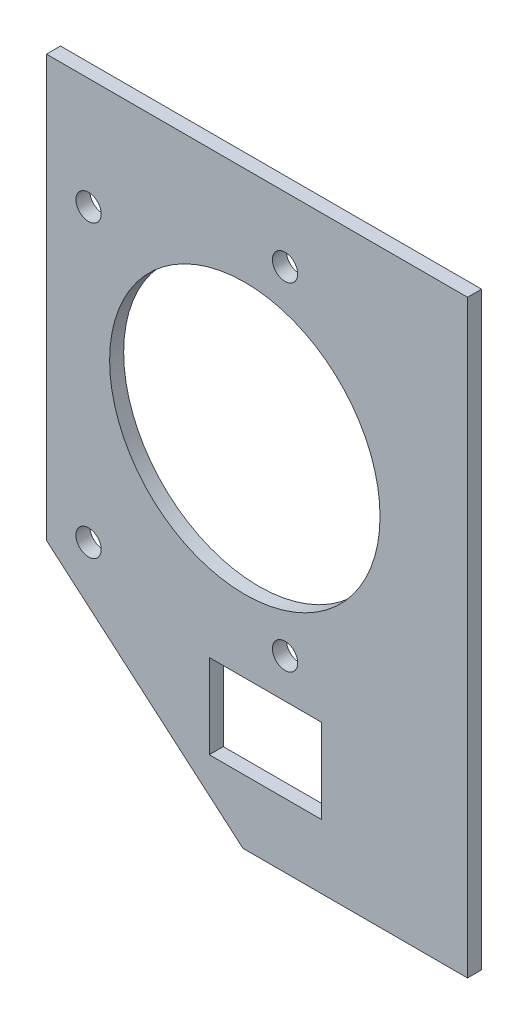
ISO-10303-21;
HEADER;
FILE_DESCRIPTION(('STEP AP214'),'2;1');
FILE_NAME('part.step','',(''),(''),'','','');
FILE_SCHEMA(('AUTOMOTIVE_DESIGN { 1 0 10303 214 1 1 1 1 }'));
ENDSEC;
DATA;
#1=APPLICATION_CONTEXT('core data for automotive mechanical design processes');
#2=APPLICATION_PROTOCOL_DEFINITION('international standard','automotive_design',2000,#1);
#3=PRODUCT_CONTEXT('',#1,'mechanical');
#4=PRODUCT('Part','Part','',(#3));
#5=PRODUCT_RELATED_PRODUCT_CATEGORY('part','',(#4));
#6=PRODUCT_DEFINITION_FORMATION('','',#4);
#7=PRODUCT_DEFINITION_CONTEXT('part definition',#1,'design');
#8=PRODUCT_DEFINITION('design','',#6,#7);
#9=PRODUCT_DEFINITION_SHAPE('','',#8);
#10=(LENGTH_UNIT() NAMED_UNIT(*) SI_UNIT(.MILLI.,.METRE.));
#11=(NAMED_UNIT(*) PLANE_ANGLE_UNIT() SI_UNIT($,.RADIAN.));
#12=(NAMED_UNIT(*) SI_UNIT($,.STERADIAN.) SOLID_ANGLE_UNIT());
#13=UNCERTAINTY_MEASURE_WITH_UNIT(LENGTH_MEASURE(1.E-05),#10,'distance_accuracy_value','');
#14=(GEOMETRIC_REPRESENTATION_CONTEXT(3) GLOBAL_UNCERTAINTY_ASSIGNED_CONTEXT((#13)) GLOBAL_UNIT_ASSIGNED_CONTEXT((#10,
#11,#12)) REPRESENTATION_CONTEXT('',''));
#15=CARTESIAN_POINT('',(0.,0.,0.));
#16=DIRECTION('',(0.,0.,1.));
#17=DIRECTION('',(1.,0.,0.));
#18=AXIS2_PLACEMENT_3D('',#15,#16,#17);
#19=CARTESIAN_POINT('',(0.,0.,5.));
#20=DIRECTION('',(1.,0.,0.));
#21=DIRECTION('',(0.,1.,0.));
#22=AXIS2_PLACEMENT_3D('',#19,#20,#21);
#23=PLANE('',#22);
#24=DIRECTION('',(0.,0.,1.));
#25=VECTOR('',#24,1.);
#26=CARTESIAN_POINT('',(0.,-150.,0.));
#27=LINE('',#26,#25);
#28=CARTESIAN_POINT('',(0.,-150.,0.));
#29=VERTEX_POINT('',#28);
#30=CARTESIAN_POINT('',(0.,-150.,5.));
#31=VERTEX_POINT('',#30);
#32=EDGE_CURVE('E47',#29,#31,#27,.T.);
#33=ORIENTED_EDGE('',*,*,#32,.T.);
#34=DIRECTION('',(0.,-1.,0.));
#35=VECTOR('',#34,1.);
#36=CARTESIAN_POINT('',(0.,0.,5.));
#37=LINE('',#36,#35);
#38=CARTESIAN_POINT('',(0.,0.,5.));
#39=VERTEX_POINT('',#38);
#40=EDGE_CURVE('E131',#39,#31,#37,.T.);
#41=ORIENTED_EDGE('',*,*,#40,.F.);
#42=DIRECTION('',(0.,0.,-1.));
#43=VECTOR('',#42,1.);
#44=CARTESIAN_POINT('',(0.,0.,5.));
#45=LINE('',#44,#43);
#46=CARTESIAN_POINT('',(0.,0.,0.));
#47=VERTEX_POINT('',#46);
#48=EDGE_CURVE('E132',#39,#47,#45,.T.);
#49=ORIENTED_EDGE('',*,*,#48,.T.);
#50=DIRECTION('',(0.,-1.,0.));
#51=VECTOR('',#50,1.);
#52=CARTESIAN_POINT('',(0.,0.,0.));
#53=LINE('',#52,#51);
#54=EDGE_CURVE('E122',#47,#29,#53,.T.);
#55=ORIENTED_EDGE('',*,*,#54,.T.);
#56=EDGE_LOOP('',(#33,#41,#49,#55));
#57=FACE_BOUND('',#56,.T.);
#58=ADVANCED_FACE('F33',(#57),#23,.F.);
#59=CARTESIAN_POINT('',(0.,-210.,5.));
#60=DIRECTION('',(0.,1.,0.));
#61=DIRECTION('',(0.,0.,1.));
#62=AXIS2_PLACEMENT_3D('',#59,#60,#61);
#63=PLANE('',#62);
#64=DIRECTION('',(0.,0.,1.));
#65=VECTOR('',#64,1.);
#66=CARTESIAN_POINT('',(70.,-210.,0.));
#67=LINE('',#66,#65);
#68=CARTESIAN_POINT('',(70.,-210.,0.));
#69=VERTEX_POINT('',#68);
#70=CARTESIAN_POINT('',(70.,-210.,5.));
#71=VERTEX_POINT('',#70);
#72=EDGE_CURVE('E103',#69,#71,#67,.T.);
#73=ORIENTED_EDGE('',*,*,#72,.F.);
#74=DIRECTION('',(1.,0.,0.));
#75=VECTOR('',#74,1.);
#76=CARTESIAN_POINT('',(0.,-210.,0.));
#77=LINE('',#76,#75);
#78=CARTESIAN_POINT('',(150.,-210.,0.));
#79=VERTEX_POINT('',#78);
#80=EDGE_CURVE('E115',#69,#79,#77,.T.);
#81=ORIENTED_EDGE('',*,*,#80,.T.);
#82=DIRECTION('',(0.,0.,-1.));
#83=VECTOR('',#82,1.);
#84=CARTESIAN_POINT('',(150.,-210.,5.));
#85=LINE('',#84,#83);
#86=CARTESIAN_POINT('',(150.,-210.,5.));
#87=VERTEX_POINT('',#86);
#88=EDGE_CURVE('E11',#87,#79,#85,.T.);
#89=ORIENTED_EDGE('',*,*,#88,.F.);
#90=DIRECTION('',(1.,0.,0.));
#91=VECTOR('',#90,1.);
#92=CARTESIAN_POINT('',(0.,-210.,5.));
#93=LINE('',#92,#91);
#94=EDGE_CURVE('E116',#71,#87,#93,.T.);
#95=ORIENTED_EDGE('',*,*,#94,.F.);
#96=EDGE_LOOP('',(#73,#81,#89,#95));
#97=FACE_BOUND('',#96,.T.);
#98=ADVANCED_FACE('F113',(#97),#63,.F.);
#99=CARTESIAN_POINT('',(0.,0.,5.));
#100=DIRECTION('',(0.,0.,1.));
#101=DIRECTION('',(1.,0.,0.));
#102=AXIS2_PLACEMENT_3D('',#99,#100,#101);
#103=PLANE('',#102);
#104=CARTESIAN_POINT('',(70.6677722872809,-83.1944538459803,5.));
#105=DIRECTION('',(0.,0.,1.));
#106=DIRECTION('',(1.,0.,0.));
#107=AXIS2_PLACEMENT_3D('',#104,#105,#106);
#108=CIRCLE('',#107,48.1568461379083);
#109=CARTESIAN_POINT('',(118.824618425189,-83.1944538459803,5.));
#110=VERTEX_POINT('',#109);
#111=EDGE_CURVE('E221',#110,#110,#108,.T.);
#112=ORIENTED_EDGE('',*,*,#111,.F.);
#113=EDGE_LOOP('',(#112));
#114=FACE_BOUND('',#113,.T.);
#115=DIRECTION('',(0.,1.,0.));
#116=VECTOR('',#115,1.);
#117=CARTESIAN_POINT('',(98.,-157.120896229608,5.));
#118=LINE('',#117,#116);
#119=CARTESIAN_POINT('',(98.,-187.120896229608,5.));
#120=VERTEX_POINT('',#119);
#121=CARTESIAN_POINT('',(98.,-157.120896229608,5.));
#122=VERTEX_POINT('',#121);
#123=EDGE_CURVE('E55',#120,#122,#118,.T.);
#124=ORIENTED_EDGE('',*,*,#123,.F.);
#125=DIRECTION('',(1.,0.,0.));
#126=VECTOR('',#125,1.);
#127=CARTESIAN_POINT('',(98.,-187.120896229608,5.));
#128=LINE('',#127,#126);
#129=CARTESIAN_POINT('',(58.,-187.120896229608,5.));
#130=VERTEX_POINT('',#129);
#131=EDGE_CURVE('E231',#130,#120,#128,.T.);
#132=ORIENTED_EDGE('',*,*,#131,.F.);
#133=DIRECTION('',(0.,-1.,0.));
#134=VECTOR('',#133,1.);
#135=CARTESIAN_POINT('',(58.,-157.120896229608,5.));
#136=LINE('',#135,#134);
#137=CARTESIAN_POINT('',(58.,-157.120896229608,5.));
#138=VERTEX_POINT('',#137);
#139=EDGE_CURVE('E245',#138,#130,#136,.T.);
#140=ORIENTED_EDGE('',*,*,#139,.F.);
#141=DIRECTION('',(-1.,0.,0.));
#142=VECTOR('',#141,1.);
#143=CARTESIAN_POINT('',(98.,-157.120896229608,5.));
#144=LINE('',#143,#142);
#145=EDGE_CURVE('E242',#122,#138,#144,.T.);
#146=ORIENTED_EDGE('',*,*,#145,.F.);
#147=EDGE_LOOP('',(#124,#132,#140,#146));
#148=FACE_BOUND('',#147,.T.);
#149=CARTESIAN_POINT('',(85.,-23.1208962296081,5.));
#150=DIRECTION('',(0.,0.,1.));
#151=DIRECTION('',(1.,0.,0.));
#152=AXIS2_PLACEMENT_3D('',#149,#150,#151);
#153=CIRCLE('',#152,4.5);
#154=CARTESIAN_POINT('',(89.5,-23.1208962296081,5.));
#155=VERTEX_POINT('',#154);
#156=EDGE_CURVE('E252',#155,#155,#153,.T.);
#157=ORIENTED_EDGE('',*,*,#156,.F.);
#158=EDGE_LOOP('',(#157));
#159=FACE_BOUND('',#158,.T.);
#160=CARTESIAN_POINT('',(85.,-143.120896229608,5.));
#161=DIRECTION('',(0.,0.,1.));
#162=DIRECTION('',(1.,0.,0.));
#163=AXIS2_PLACEMENT_3D('',#160,#161,#162);
#164=CIRCLE('',#163,4.5);
#165=CARTESIAN_POINT('',(89.5,-143.120896229608,5.));
#166=VERTEX_POINT('',#165);
#167=EDGE_CURVE('E263',#166,#166,#164,.T.);
#168=ORIENTED_EDGE('',*,*,#167,.F.);
#169=EDGE_LOOP('',(#168));
#170=FACE_BOUND('',#169,.T.);
#171=CARTESIAN_POINT('',(15.,-143.120896229608,5.));
#172=DIRECTION('',(0.,0.,1.));
#173=DIRECTION('',(1.,0.,0.));
#174=AXIS2_PLACEMENT_3D('',#171,#172,#173);
#175=CIRCLE('',#174,4.5);
#176=CARTESIAN_POINT('',(19.5,-143.120896229608,5.));
#177=VERTEX_POINT('',#176);
#178=EDGE_CURVE('E269',#177,#177,#175,.T.);
#179=ORIENTED_EDGE('',*,*,#178,.F.);
#180=EDGE_LOOP('',(#179));
#181=FACE_BOUND('',#180,.T.);
#182=CARTESIAN_POINT('',(15.,-39.6208962296081,5.));
#183=DIRECTION('',(0.,0.,1.));
#184=DIRECTION('',(1.,0.,0.));
#185=AXIS2_PLACEMENT_3D('',#182,#183,#184);
#186=CIRCLE('',#185,4.5);
#187=CARTESIAN_POINT('',(19.5,-39.6208962296081,5.));
#188=VERTEX_POINT('',#187);
#189=EDGE_CURVE('E274',#188,#188,#186,.T.);
#190=ORIENTED_EDGE('',*,*,#189,.F.);
#191=EDGE_LOOP('',(#190));
#192=FACE_BOUND('',#191,.T.);
#193=ORIENTED_EDGE('',*,*,#40,.T.);
#194=DIRECTION('',(0.759256602365297,-0.650791373455968,0.));
#195=VECTOR('',#194,1.);
#196=CARTESIAN_POINT('',(0.,-150.,5.));
#197=LINE('',#196,#195);
#198=EDGE_CURVE('E109',#31,#71,#197,.T.);
#199=ORIENTED_EDGE('',*,*,#198,.T.);
#200=ORIENTED_EDGE('',*,*,#94,.T.);
#201=DIRECTION('',(0.,1.,0.));
#202=VECTOR('',#201,1.);
#203=CARTESIAN_POINT('',(150.,0.,5.));
#204=LINE('',#203,#202);
#205=CARTESIAN_POINT('',(150.,0.,5.));
#206=VERTEX_POINT('',#205);
#207=EDGE_CURVE('E148',#87,#206,#204,.T.);
#208=ORIENTED_EDGE('',*,*,#207,.T.);
#209=DIRECTION('',(-1.,0.,0.));
#210=VECTOR('',#209,1.);
#211=CARTESIAN_POINT('',(0.,0.,5.));
#212=LINE('',#211,#210);
#213=EDGE_CURVE('E134',#206,#39,#212,.T.);
#214=ORIENTED_EDGE('',*,*,#213,.T.);
#215=EDGE_LOOP('',(#193,#199,#200,#208,#214));
#216=FACE_BOUND('',#215,.T.);
#217=ADVANCED_FACE('F153',(#114,#148,#159,#170,#181,#192,#216),#103,.T.);
#218=CARTESIAN_POINT('',(0.,0.,0.));
#219=DIRECTION('',(0.,0.,1.));
#220=DIRECTION('',(1.,0.,0.));
#221=AXIS2_PLACEMENT_3D('',#218,#219,#220);
#222=PLANE('',#221);
#223=CARTESIAN_POINT('',(70.6677722872809,-83.1944538459803,0.));
#224=DIRECTION('',(0.,0.,1.));
#225=DIRECTION('',(1.,0.,0.));
#226=AXIS2_PLACEMENT_3D('',#223,#224,#225);
#227=CIRCLE('',#226,48.1568461379083);
#228=CARTESIAN_POINT('',(118.824618425189,-83.1944538459803,0.));
#229=VERTEX_POINT('',#228);
#230=EDGE_CURVE('E219',#229,#229,#227,.T.);
#231=ORIENTED_EDGE('',*,*,#230,.T.);
#232=EDGE_LOOP('',(#231));
#233=FACE_BOUND('',#232,.T.);
#234=CARTESIAN_POINT('',(15.,-39.6208962296081,0.));
#235=DIRECTION('',(0.,0.,1.));
#236=DIRECTION('',(1.,0.,0.));
#237=AXIS2_PLACEMENT_3D('',#234,#235,#236);
#238=CIRCLE('',#237,4.5);
#239=CARTESIAN_POINT('',(19.5,-39.6208962296081,0.));
#240=VERTEX_POINT('',#239);
#241=EDGE_CURVE('E126',#240,#240,#238,.T.);
#242=ORIENTED_EDGE('',*,*,#241,.T.);
#243=EDGE_LOOP('',(#242));
#244=FACE_BOUND('',#243,.T.);
#245=CARTESIAN_POINT('',(15.,-143.120896229608,0.));
#246=DIRECTION('',(0.,0.,1.));
#247=DIRECTION('',(1.,0.,0.));
#248=AXIS2_PLACEMENT_3D('',#245,#246,#247);
#249=CIRCLE('',#248,4.5);
#250=CARTESIAN_POINT('',(19.5,-143.120896229608,0.));
#251=VERTEX_POINT('',#250);
#252=EDGE_CURVE('E272',#251,#251,#249,.T.);
#253=ORIENTED_EDGE('',*,*,#252,.T.);
#254=EDGE_LOOP('',(#253));
#255=FACE_BOUND('',#254,.T.);
#256=CARTESIAN_POINT('',(85.,-143.120896229608,0.));
#257=DIRECTION('',(0.,0.,1.));
#258=DIRECTION('',(1.,0.,0.));
#259=AXIS2_PLACEMENT_3D('',#256,#257,#258);
#260=CIRCLE('',#259,4.5);
#261=CARTESIAN_POINT('',(89.5,-143.120896229608,0.));
#262=VERTEX_POINT('',#261);
#263=EDGE_CURVE('E266',#262,#262,#260,.T.);
#264=ORIENTED_EDGE('',*,*,#263,.T.);
#265=EDGE_LOOP('',(#264));
#266=FACE_BOUND('',#265,.T.);
#267=CARTESIAN_POINT('',(85.,-23.1208962296081,0.));
#268=DIRECTION('',(0.,0.,1.));
#269=DIRECTION('',(1.,0.,0.));
#270=AXIS2_PLACEMENT_3D('',#267,#268,#269);
#271=CIRCLE('',#270,4.5);
#272=CARTESIAN_POINT('',(89.5,-23.1208962296081,0.));
#273=VERTEX_POINT('',#272);
#274=EDGE_CURVE('E260',#273,#273,#271,.T.);
#275=ORIENTED_EDGE('',*,*,#274,.T.);
#276=EDGE_LOOP('',(#275));
#277=FACE_BOUND('',#276,.T.);
#278=DIRECTION('',(1.,0.,0.));
#279=VECTOR('',#278,1.);
#280=CARTESIAN_POINT('',(98.,-187.120896229608,0.));
#281=LINE('',#280,#279);
#282=CARTESIAN_POINT('',(58.,-187.120896229608,0.));
#283=VERTEX_POINT('',#282);
#284=CARTESIAN_POINT('',(98.,-187.120896229608,0.));
#285=VERTEX_POINT('',#284);
#286=EDGE_CURVE('E237',#283,#285,#281,.T.);
#287=ORIENTED_EDGE('',*,*,#286,.T.);
#288=DIRECTION('',(0.,1.,0.));
#289=VECTOR('',#288,1.);
#290=CARTESIAN_POINT('',(98.,-157.120896229608,0.));
#291=LINE('',#290,#289);
#292=CARTESIAN_POINT('',(98.,-157.120896229608,0.));
#293=VERTEX_POINT('',#292);
#294=EDGE_CURVE('E227',#285,#293,#291,.T.);
#295=ORIENTED_EDGE('',*,*,#294,.T.);
#296=DIRECTION('',(-1.,0.,0.));
#297=VECTOR('',#296,1.);
#298=CARTESIAN_POINT('',(98.,-157.120896229608,0.));
#299=LINE('',#298,#297);
#300=CARTESIAN_POINT('',(58.,-157.120896229608,0.));
#301=VERTEX_POINT('',#300);
#302=EDGE_CURVE('E230',#293,#301,#299,.T.);
#303=ORIENTED_EDGE('',*,*,#302,.T.);
#304=DIRECTION('',(0.,-1.,0.));
#305=VECTOR('',#304,1.);
#306=CARTESIAN_POINT('',(58.,-157.120896229608,0.));
#307=LINE('',#306,#305);
#308=EDGE_CURVE('E234',#301,#283,#307,.T.);
#309=ORIENTED_EDGE('',*,*,#308,.T.);
#310=EDGE_LOOP('',(#287,#295,#303,#309));
#311=FACE_BOUND('',#310,.T.);
#312=DIRECTION('',(0.759256602365297,-0.650791373455968,0.));
#313=VECTOR('',#312,1.);
#314=CARTESIAN_POINT('',(0.,-150.,0.));
#315=LINE('',#314,#313);
#316=EDGE_CURVE('E100',#29,#69,#315,.T.);
#317=ORIENTED_EDGE('',*,*,#316,.F.);
#318=ORIENTED_EDGE('',*,*,#54,.F.);
#319=DIRECTION('',(-1.,0.,0.));
#320=VECTOR('',#319,1.);
#321=CARTESIAN_POINT('',(0.,0.,0.));
#322=LINE('',#321,#320);
#323=CARTESIAN_POINT('',(150.,0.,0.));
#324=VERTEX_POINT('',#323);
#325=EDGE_CURVE('E124',#324,#47,#322,.T.);
#326=ORIENTED_EDGE('',*,*,#325,.F.);
#327=DIRECTION('',(0.,1.,0.));
#328=VECTOR('',#327,1.);
#329=CARTESIAN_POINT('',(150.,0.,0.));
#330=LINE('',#329,#328);
#331=EDGE_CURVE('E121',#79,#324,#330,.T.);
#332=ORIENTED_EDGE('',*,*,#331,.F.);
#333=ORIENTED_EDGE('',*,*,#80,.F.);
#334=EDGE_LOOP('',(#317,#318,#326,#332,#333));
#335=FACE_BOUND('',#334,.T.);
#336=ADVANCED_FACE('F119',(#233,#244,#255,#266,#277,#311,#335),#222,.F.);
#337=CARTESIAN_POINT('',(150.,0.,5.));
#338=DIRECTION('',(-1.,0.,0.));
#339=DIRECTION('',(0.,-1.,0.));
#340=AXIS2_PLACEMENT_3D('',#337,#338,#339);
#341=PLANE('',#340);
#342=ORIENTED_EDGE('',*,*,#331,.T.);
#343=DIRECTION('',(0.,0.,-1.));
#344=VECTOR('',#343,1.);
#345=CARTESIAN_POINT('',(150.,0.,5.));
#346=LINE('',#345,#344);
#347=EDGE_CURVE('E40',#206,#324,#346,.T.);
#348=ORIENTED_EDGE('',*,*,#347,.F.);
#349=ORIENTED_EDGE('',*,*,#207,.F.);
#350=ORIENTED_EDGE('',*,*,#88,.T.);
#351=EDGE_LOOP('',(#342,#348,#349,#350));
#352=FACE_BOUND('',#351,.T.);
#353=ADVANCED_FACE('F154',(#352),#341,.F.);
#354=CARTESIAN_POINT('',(0.,0.,5.));
#355=DIRECTION('',(0.,-1.,0.));
#356=DIRECTION('',(0.,0.,-1.));
#357=AXIS2_PLACEMENT_3D('',#354,#355,#356);
#358=PLANE('',#357);
#359=ORIENTED_EDGE('',*,*,#325,.T.);
#360=ORIENTED_EDGE('',*,*,#48,.F.);
#361=ORIENTED_EDGE('',*,*,#213,.F.);
#362=ORIENTED_EDGE('',*,*,#347,.T.);
#363=EDGE_LOOP('',(#359,#360,#361,#362));
#364=FACE_BOUND('',#363,.T.);
#365=ADVANCED_FACE('F139',(#364),#358,.F.);
#366=CARTESIAN_POINT('',(15.,-39.6208962296081,5.));
#367=DIRECTION('',(0.,0.,1.));
#368=DIRECTION('',(1.,0.,0.));
#369=AXIS2_PLACEMENT_3D('',#366,#367,#368);
#370=CYLINDRICAL_SURFACE('',#369,4.5);
#371=ORIENTED_EDGE('',*,*,#241,.F.);
#372=EDGE_LOOP('',(#371));
#373=FACE_BOUND('',#372,.T.);
#374=ORIENTED_EDGE('',*,*,#189,.T.);
#375=EDGE_LOOP('',(#374));
#376=FACE_BOUND('',#375,.T.);
#377=ADVANCED_FACE('F161',(#373,#376),#370,.F.);
#378=CARTESIAN_POINT('',(15.,-143.120896229608,5.));
#379=DIRECTION('',(0.,0.,1.));
#380=DIRECTION('',(1.,0.,0.));
#381=AXIS2_PLACEMENT_3D('',#378,#379,#380);
#382=CYLINDRICAL_SURFACE('',#381,4.5);
#383=ORIENTED_EDGE('',*,*,#252,.F.);
#384=EDGE_LOOP('',(#383));
#385=FACE_BOUND('',#384,.T.);
#386=ORIENTED_EDGE('',*,*,#178,.T.);
#387=EDGE_LOOP('',(#386));
#388=FACE_BOUND('',#387,.T.);
#389=ADVANCED_FACE('F181',(#385,#388),#382,.F.);
#390=CARTESIAN_POINT('',(85.,-143.120896229608,5.));
#391=DIRECTION('',(0.,0.,1.));
#392=DIRECTION('',(1.,0.,0.));
#393=AXIS2_PLACEMENT_3D('',#390,#391,#392);
#394=CYLINDRICAL_SURFACE('',#393,4.5);
#395=ORIENTED_EDGE('',*,*,#263,.F.);
#396=EDGE_LOOP('',(#395));
#397=FACE_BOUND('',#396,.T.);
#398=ORIENTED_EDGE('',*,*,#167,.T.);
#399=EDGE_LOOP('',(#398));
#400=FACE_BOUND('',#399,.T.);
#401=ADVANCED_FACE('F185',(#397,#400),#394,.F.);
#402=CARTESIAN_POINT('',(85.,-23.1208962296081,5.));
#403=DIRECTION('',(0.,0.,1.));
#404=DIRECTION('',(1.,0.,0.));
#405=AXIS2_PLACEMENT_3D('',#402,#403,#404);
#406=CYLINDRICAL_SURFACE('',#405,4.5);
#407=ORIENTED_EDGE('',*,*,#274,.F.);
#408=EDGE_LOOP('',(#407));
#409=FACE_BOUND('',#408,.T.);
#410=ORIENTED_EDGE('',*,*,#156,.T.);
#411=EDGE_LOOP('',(#410));
#412=FACE_BOUND('',#411,.T.);
#413=ADVANCED_FACE('F189',(#409,#412),#406,.F.);
#414=CARTESIAN_POINT('',(98.,-157.120896229608,0.));
#415=DIRECTION('',(1.,0.,0.));
#416=DIRECTION('',(0.,1.,0.));
#417=AXIS2_PLACEMENT_3D('',#414,#415,#416);
#418=PLANE('',#417);
#419=ORIENTED_EDGE('',*,*,#123,.T.);
#420=DIRECTION('',(0.,0.,1.));
#421=VECTOR('',#420,1.);
#422=CARTESIAN_POINT('',(98.,-157.120896229608,0.));
#423=LINE('',#422,#421);
#424=EDGE_CURVE('E240',#293,#122,#423,.T.);
#425=ORIENTED_EDGE('',*,*,#424,.F.);
#426=ORIENTED_EDGE('',*,*,#294,.F.);
#427=DIRECTION('',(0.,0.,1.));
#428=VECTOR('',#427,1.);
#429=CARTESIAN_POINT('',(98.,-187.120896229608,0.));
#430=LINE('',#429,#428);
#431=EDGE_CURVE('E250',#285,#120,#430,.T.);
#432=ORIENTED_EDGE('',*,*,#431,.T.);
#433=EDGE_LOOP('',(#419,#425,#426,#432));
#434=FACE_BOUND('',#433,.T.);
#435=ADVANCED_FACE('F193',(#434),#418,.F.);
#436=CARTESIAN_POINT('',(98.,-187.120896229608,0.));
#437=DIRECTION('',(0.,-1.,0.));
#438=DIRECTION('',(0.,0.,-1.));
#439=AXIS2_PLACEMENT_3D('',#436,#437,#438);
#440=PLANE('',#439);
#441=ORIENTED_EDGE('',*,*,#131,.T.);
#442=ORIENTED_EDGE('',*,*,#431,.F.);
#443=ORIENTED_EDGE('',*,*,#286,.F.);
#444=DIRECTION('',(0.,0.,1.));
#445=VECTOR('',#444,1.);
#446=CARTESIAN_POINT('',(58.,-187.120896229608,0.));
#447=LINE('',#446,#445);
#448=EDGE_CURVE('E253',#283,#130,#447,.T.);
#449=ORIENTED_EDGE('',*,*,#448,.T.);
#450=EDGE_LOOP('',(#441,#442,#443,#449));
#451=FACE_BOUND('',#450,.T.);
#452=ADVANCED_FACE('F197',(#451),#440,.F.);
#453=CARTESIAN_POINT('',(58.,-157.120896229608,0.));
#454=DIRECTION('',(-1.,0.,0.));
#455=DIRECTION('',(0.,0.,1.));
#456=AXIS2_PLACEMENT_3D('',#453,#454,#455);
#457=PLANE('',#456);
#458=ORIENTED_EDGE('',*,*,#139,.T.);
#459=ORIENTED_EDGE('',*,*,#448,.F.);
#460=ORIENTED_EDGE('',*,*,#308,.F.);
#461=DIRECTION('',(0.,0.,1.));
#462=VECTOR('',#461,1.);
#463=CARTESIAN_POINT('',(58.,-157.120896229608,0.));
#464=LINE('',#463,#462);
#465=EDGE_CURVE('E255',#301,#138,#464,.T.);
#466=ORIENTED_EDGE('',*,*,#465,.T.);
#467=EDGE_LOOP('',(#458,#459,#460,#466));
#468=FACE_BOUND('',#467,.T.);
#469=ADVANCED_FACE('F201',(#468),#457,.F.);
#470=CARTESIAN_POINT('',(98.,-157.120896229608,0.));
#471=DIRECTION('',(0.,1.,0.));
#472=DIRECTION('',(0.,0.,1.));
#473=AXIS2_PLACEMENT_3D('',#470,#471,#472);
#474=PLANE('',#473);
#475=ORIENTED_EDGE('',*,*,#145,.T.);
#476=ORIENTED_EDGE('',*,*,#465,.F.);
#477=ORIENTED_EDGE('',*,*,#302,.F.);
#478=ORIENTED_EDGE('',*,*,#424,.T.);
#479=EDGE_LOOP('',(#475,#476,#477,#478));
#480=FACE_BOUND('',#479,.T.);
#481=ADVANCED_FACE('F198',(#480),#474,.F.);
#482=CARTESIAN_POINT('',(0.,-150.,0.));
#483=DIRECTION('',(-0.650791373455968,-0.759256602365297,0.));
#484=DIRECTION('',(0.759256602365297,-0.650791373455968,0.));
#485=AXIS2_PLACEMENT_3D('',#482,#483,#484);
#486=PLANE('',#485);
#487=ORIENTED_EDGE('',*,*,#198,.F.);
#488=ORIENTED_EDGE('',*,*,#32,.F.);
#489=ORIENTED_EDGE('',*,*,#316,.T.);
#490=ORIENTED_EDGE('',*,*,#72,.T.);
#491=EDGE_LOOP('',(#487,#488,#489,#490));
#492=FACE_BOUND('',#491,.T.);
#493=ADVANCED_FACE('F102',(#492),#486,.T.);
#494=CARTESIAN_POINT('',(70.6677722872809,-83.1944538459803,0.));
#495=DIRECTION('',(0.,0.,1.));
#496=DIRECTION('',(1.,0.,0.));
#497=AXIS2_PLACEMENT_3D('',#494,#495,#496);
#498=CYLINDRICAL_SURFACE('',#497,48.1568461379083);
#499=ORIENTED_EDGE('',*,*,#230,.F.);
#500=EDGE_LOOP('',(#499));
#501=FACE_BOUND('',#500,.T.);
#502=ORIENTED_EDGE('',*,*,#111,.T.);
#503=EDGE_LOOP('',(#502));
#504=FACE_BOUND('',#503,.T.);
#505=ADVANCED_FACE('F211',(#501,#504),#498,.F.);
#506=CLOSED_SHELL('',(#58,#98,#217,#336,#353,#365,#377,#389,#401,#413,#435,#452,#469,#481,#493,#505));
#507=MANIFOLD_SOLID_BREP('B2',#506);
#508=ADVANCED_BREP_SHAPE_REPRESENTATION('',(#18,#507),#14);
#509=SHAPE_DEFINITION_REPRESENTATION(#9,#508);
ENDSEC;
END-ISO-10303-21;
